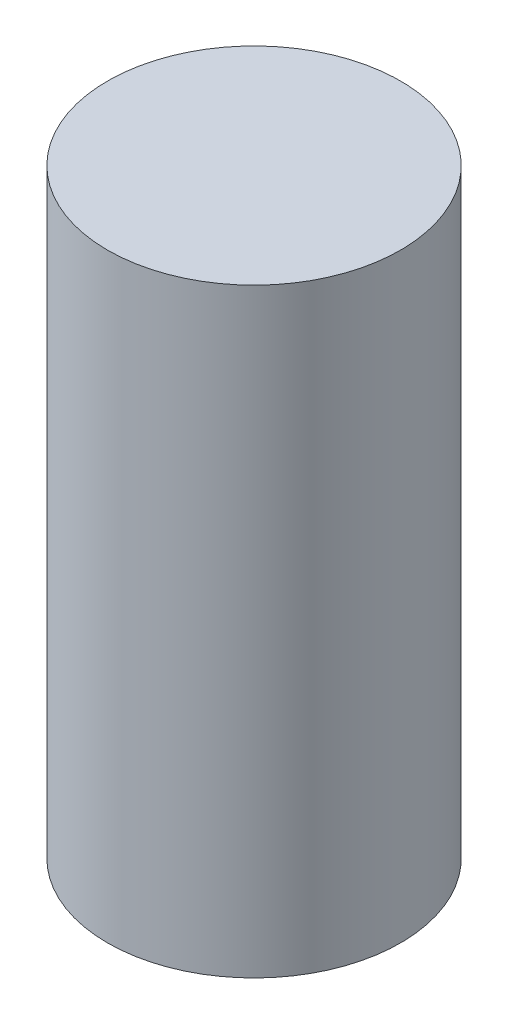
ISO-10303-21;
HEADER;
FILE_DESCRIPTION(('STEP AP214'),'2;1');
FILE_NAME('part.step','',(''),(''),'','','');
FILE_SCHEMA(('AUTOMOTIVE_DESIGN { 1 0 10303 214 1 1 1 1 }'));
ENDSEC;
DATA;
#1=APPLICATION_CONTEXT('core data for automotive mechanical design processes');
#2=APPLICATION_PROTOCOL_DEFINITION('international standard','automotive_design',2000,#1);
#3=PRODUCT_CONTEXT('',#1,'mechanical');
#4=PRODUCT('Part','Part','',(#3));
#5=PRODUCT_RELATED_PRODUCT_CATEGORY('part','',(#4));
#6=PRODUCT_DEFINITION_FORMATION('','',#4);
#7=PRODUCT_DEFINITION_CONTEXT('part definition',#1,'design');
#8=PRODUCT_DEFINITION('design','',#6,#7);
#9=PRODUCT_DEFINITION_SHAPE('','',#8);
#10=(LENGTH_UNIT() NAMED_UNIT(*) SI_UNIT(.MILLI.,.METRE.));
#11=(NAMED_UNIT(*) PLANE_ANGLE_UNIT() SI_UNIT($,.RADIAN.));
#12=(NAMED_UNIT(*) SI_UNIT($,.STERADIAN.) SOLID_ANGLE_UNIT());
#13=UNCERTAINTY_MEASURE_WITH_UNIT(LENGTH_MEASURE(1.E-05),#10,'distance_accuracy_value','');
#14=(GEOMETRIC_REPRESENTATION_CONTEXT(3) GLOBAL_UNCERTAINTY_ASSIGNED_CONTEXT((#13)) GLOBAL_UNIT_ASSIGNED_CONTEXT((#10,
#11,#12)) REPRESENTATION_CONTEXT('',''));
#15=CARTESIAN_POINT('',(0.,0.,0.));
#16=DIRECTION('',(0.,0.,1.));
#17=DIRECTION('',(1.,0.,0.));
#18=AXIS2_PLACEMENT_3D('',#15,#16,#17);
#19=CARTESIAN_POINT('',(0.,129.,0.));
#20=DIRECTION('',(0.,-1.,0.));
#21=DIRECTION('',(0.,0.,-1.));
#22=AXIS2_PLACEMENT_3D('',#19,#20,#21);
#23=CYLINDRICAL_SURFACE('',#22,31.5);
#24=CARTESIAN_POINT('',(0.,129.,0.));
#25=DIRECTION('',(0.,1.,0.));
#26=DIRECTION('',(0.,0.,1.));
#27=AXIS2_PLACEMENT_3D('',#24,#25,#26);
#28=CIRCLE('',#27,31.5);
#29=CARTESIAN_POINT('',(0.,129.,31.5));
#30=VERTEX_POINT('',#29);
#31=EDGE_CURVE('E10',#30,#30,#28,.T.);
#32=ORIENTED_EDGE('',*,*,#31,.F.);
#33=EDGE_LOOP('',(#32));
#34=FACE_BOUND('',#33,.T.);
#35=CARTESIAN_POINT('',(0.,0.,0.));
#36=DIRECTION('',(0.,1.,0.));
#37=DIRECTION('',(0.,0.,1.));
#38=AXIS2_PLACEMENT_3D('',#35,#36,#37);
#39=CIRCLE('',#38,31.5);
#40=CARTESIAN_POINT('',(0.,0.,31.5));
#41=VERTEX_POINT('',#40);
#42=EDGE_CURVE('E34',#41,#41,#39,.T.);
#43=ORIENTED_EDGE('',*,*,#42,.T.);
#44=EDGE_LOOP('',(#43));
#45=FACE_BOUND('',#44,.T.);
#46=ADVANCED_FACE('F31',(#34,#45),#23,.T.);
#47=CARTESIAN_POINT('',(0.,129.,0.));
#48=DIRECTION('',(0.,1.,0.));
#49=DIRECTION('',(0.,0.,1.));
#50=AXIS2_PLACEMENT_3D('',#47,#48,#49);
#51=PLANE('',#50);
#52=ORIENTED_EDGE('',*,*,#31,.T.);
#53=EDGE_LOOP('',(#52));
#54=FACE_BOUND('',#53,.T.);
#55=ADVANCED_FACE('F46',(#54),#51,.T.);
#56=CARTESIAN_POINT('',(0.,0.,0.));
#57=DIRECTION('',(0.,1.,0.));
#58=DIRECTION('',(0.,0.,1.));
#59=AXIS2_PLACEMENT_3D('',#56,#57,#58);
#60=PLANE('',#59);
#61=ORIENTED_EDGE('',*,*,#42,.F.);
#62=EDGE_LOOP('',(#61));
#63=FACE_BOUND('',#62,.T.);
#64=ADVANCED_FACE('F44',(#63),#60,.F.);
#65=CLOSED_SHELL('',(#46,#55,#64));
#66=MANIFOLD_SOLID_BREP('B2',#65);
#67=ADVANCED_BREP_SHAPE_REPRESENTATION('',(#18,#66),#14);
#68=SHAPE_DEFINITION_REPRESENTATION(#9,#67);
ENDSEC;
END-ISO-10303-21;
